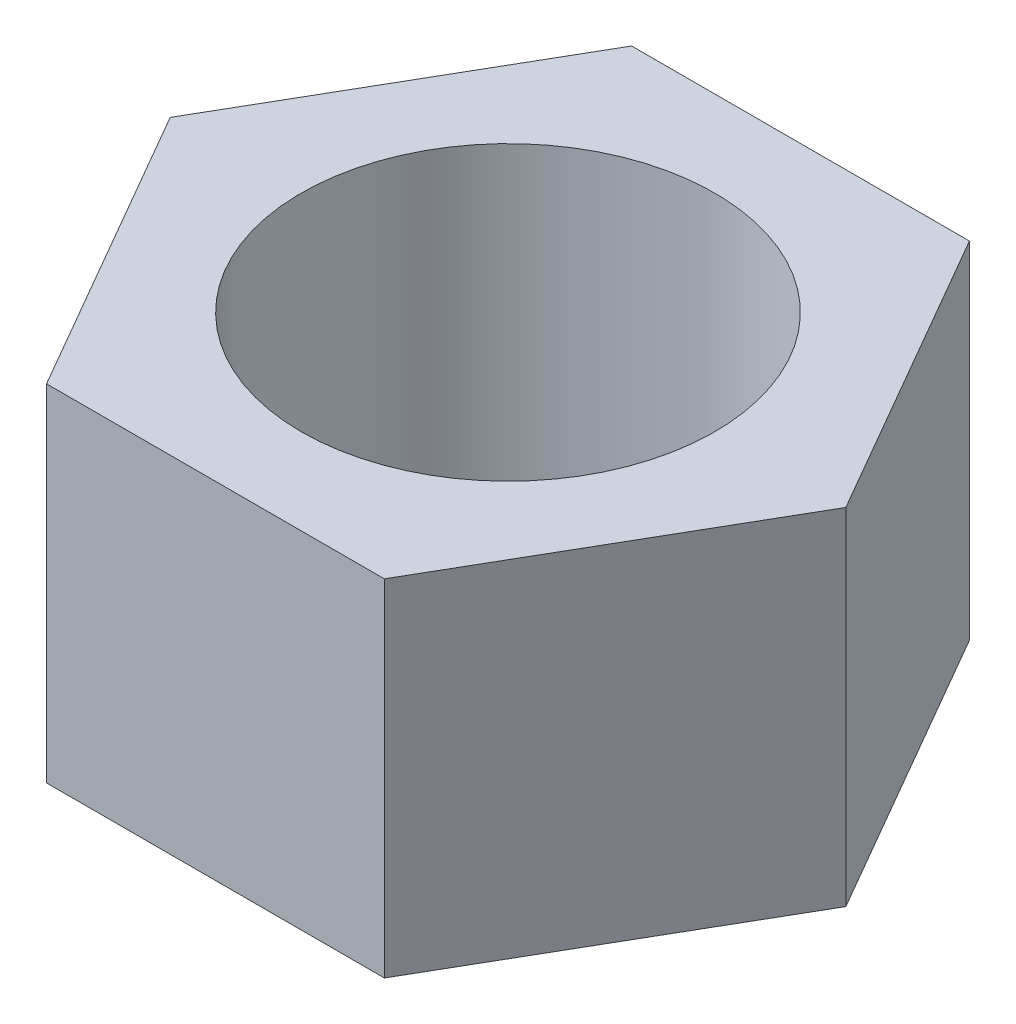
ISO-10303-21;
HEADER;
FILE_DESCRIPTION(('STEP AP214'),'2;1');
FILE_NAME('part.step','',(''),(''),'','','');
FILE_SCHEMA(('AUTOMOTIVE_DESIGN { 1 0 10303 214 1 1 1 1 }'));
ENDSEC;
DATA;
#1=APPLICATION_CONTEXT('core data for automotive mechanical design processes');
#2=APPLICATION_PROTOCOL_DEFINITION('international standard','automotive_design',2000,#1);
#3=PRODUCT_CONTEXT('',#1,'mechanical');
#4=PRODUCT('Part','Part','',(#3));
#5=PRODUCT_RELATED_PRODUCT_CATEGORY('part','',(#4));
#6=PRODUCT_DEFINITION_FORMATION('','',#4);
#7=PRODUCT_DEFINITION_CONTEXT('part definition',#1,'design');
#8=PRODUCT_DEFINITION('design','',#6,#7);
#9=PRODUCT_DEFINITION_SHAPE('','',#8);
#10=(LENGTH_UNIT() NAMED_UNIT(*) SI_UNIT(.MILLI.,.METRE.));
#11=(NAMED_UNIT(*) PLANE_ANGLE_UNIT() SI_UNIT($,.RADIAN.));
#12=(NAMED_UNIT(*) SI_UNIT($,.STERADIAN.) SOLID_ANGLE_UNIT());
#13=UNCERTAINTY_MEASURE_WITH_UNIT(LENGTH_MEASURE(1.E-05),#10,'distance_accuracy_value','');
#14=(GEOMETRIC_REPRESENTATION_CONTEXT(3) GLOBAL_UNCERTAINTY_ASSIGNED_CONTEXT((#13)) GLOBAL_UNIT_ASSIGNED_CONTEXT((#10,
#11,#12)) REPRESENTATION_CONTEXT('',''));
#15=CARTESIAN_POINT('',(0.,0.,0.));
#16=DIRECTION('',(0.,0.,1.));
#17=DIRECTION('',(1.,0.,0.));
#18=AXIS2_PLACEMENT_3D('',#15,#16,#17);
#19=CARTESIAN_POINT('',(4.08475315451667,8.36,7.07499999999993));
#20=DIRECTION('',(-0.866025403784442,0.,-0.499999999999995));
#21=DIRECTION('',(-0.499999999999995,0.,0.866025403784442));
#22=AXIS2_PLACEMENT_3D('',#19,#20,#21);
#23=PLANE('',#22);
#24=DIRECTION('',(0.499999999999995,0.,-0.866025403784442));
#25=VECTOR('',#24,1.);
#26=CARTESIAN_POINT('',(4.08475315451667,0.,7.07499999999993));
#27=LINE('',#26,#25);
#28=CARTESIAN_POINT('',(4.08475315451667,0.,7.07499999999993));
#29=VERTEX_POINT('',#28);
#30=CARTESIAN_POINT('',(8.16950630903318,0.,0.));
#31=VERTEX_POINT('',#30);
#32=EDGE_CURVE('E128',#29,#31,#27,.T.);
#33=ORIENTED_EDGE('',*,*,#32,.T.);
#34=DIRECTION('',(0.,-1.,0.));
#35=VECTOR('',#34,1.);
#36=CARTESIAN_POINT('',(8.16950630903318,8.36,0.));
#37=LINE('',#36,#35);
#38=CARTESIAN_POINT('',(8.16950630903318,8.36,0.));
#39=VERTEX_POINT('',#38);
#40=EDGE_CURVE('E11',#39,#31,#37,.T.);
#41=ORIENTED_EDGE('',*,*,#40,.F.);
#42=DIRECTION('',(0.499999999999995,0.,-0.866025403784442));
#43=VECTOR('',#42,1.);
#44=CARTESIAN_POINT('',(4.08475315451667,8.36,7.07499999999993));
#45=LINE('',#44,#43);
#46=CARTESIAN_POINT('',(4.08475315451667,8.36,7.07499999999993));
#47=VERTEX_POINT('',#46);
#48=EDGE_CURVE('E145',#47,#39,#45,.T.);
#49=ORIENTED_EDGE('',*,*,#48,.F.);
#50=DIRECTION('',(0.,-1.,0.));
#51=VECTOR('',#50,1.);
#52=CARTESIAN_POINT('',(4.08475315451667,8.36,7.07499999999993));
#53=LINE('',#52,#51);
#54=EDGE_CURVE('E124',#47,#29,#53,.T.);
#55=ORIENTED_EDGE('',*,*,#54,.T.);
#56=EDGE_LOOP('',(#33,#41,#49,#55));
#57=FACE_BOUND('',#56,.T.);
#58=ADVANCED_FACE('F39',(#57),#23,.F.);
#59=CARTESIAN_POINT('',(8.16950630903318,8.36,0.));
#60=DIRECTION('',(-0.866025403784438,0.,0.500000000000001));
#61=DIRECTION('',(0.500000000000001,0.,0.866025403784438));
#62=AXIS2_PLACEMENT_3D('',#59,#60,#61);
#63=PLANE('',#62);
#64=DIRECTION('',(-0.500000000000001,0.,-0.866025403784438));
#65=VECTOR('',#64,1.);
#66=CARTESIAN_POINT('',(8.16950630903318,0.,0.));
#67=LINE('',#66,#65);
#68=CARTESIAN_POINT('',(4.08475315451657,0.,-7.07499999999999));
#69=VERTEX_POINT('',#68);
#70=EDGE_CURVE('E132',#31,#69,#67,.T.);
#71=ORIENTED_EDGE('',*,*,#70,.T.);
#72=DIRECTION('',(0.,-1.,0.));
#73=VECTOR('',#72,1.);
#74=CARTESIAN_POINT('',(4.08475315451657,8.36,-7.07499999999999));
#75=LINE('',#74,#73);
#76=CARTESIAN_POINT('',(4.08475315451657,8.36,-7.07499999999999));
#77=VERTEX_POINT('',#76);
#78=EDGE_CURVE('E48',#77,#69,#75,.T.);
#79=ORIENTED_EDGE('',*,*,#78,.F.);
#80=DIRECTION('',(-0.500000000000001,0.,-0.866025403784438));
#81=VECTOR('',#80,1.);
#82=CARTESIAN_POINT('',(8.16950630903318,8.36,0.));
#83=LINE('',#82,#81);
#84=EDGE_CURVE('E93',#39,#77,#83,.T.);
#85=ORIENTED_EDGE('',*,*,#84,.F.);
#86=ORIENTED_EDGE('',*,*,#40,.T.);
#87=EDGE_LOOP('',(#71,#79,#85,#86));
#88=FACE_BOUND('',#87,.T.);
#89=ADVANCED_FACE('F174',(#88),#63,.F.);
#90=CARTESIAN_POINT('',(4.08475315451657,8.36,-7.07499999999999));
#91=DIRECTION('',(0.,0.,1.));
#92=DIRECTION('',(1.,0.,0.));
#93=AXIS2_PLACEMENT_3D('',#90,#91,#92);
#94=PLANE('',#93);
#95=DIRECTION('',(-1.,0.,0.));
#96=VECTOR('',#95,1.);
#97=CARTESIAN_POINT('',(4.08475315451657,0.,-7.07499999999999));
#98=LINE('',#97,#96);
#99=CARTESIAN_POINT('',(-4.08475315451662,0.,-7.07499999999996));
#100=VERTEX_POINT('',#99);
#101=EDGE_CURVE('E136',#69,#100,#98,.T.);
#102=ORIENTED_EDGE('',*,*,#101,.T.);
#103=DIRECTION('',(0.,-1.,0.));
#104=VECTOR('',#103,1.);
#105=CARTESIAN_POINT('',(-4.08475315451662,8.36,-7.07499999999996));
#106=LINE('',#105,#104);
#107=CARTESIAN_POINT('',(-4.08475315451662,8.36,-7.07499999999996));
#108=VERTEX_POINT('',#107);
#109=EDGE_CURVE('E117',#108,#100,#106,.T.);
#110=ORIENTED_EDGE('',*,*,#109,.F.);
#111=DIRECTION('',(-1.,0.,0.));
#112=VECTOR('',#111,1.);
#113=CARTESIAN_POINT('',(4.08475315451657,8.36,-7.07499999999999));
#114=LINE('',#113,#112);
#115=EDGE_CURVE('E106',#77,#108,#114,.T.);
#116=ORIENTED_EDGE('',*,*,#115,.F.);
#117=ORIENTED_EDGE('',*,*,#78,.T.);
#118=EDGE_LOOP('',(#102,#110,#116,#117));
#119=FACE_BOUND('',#118,.T.);
#120=ADVANCED_FACE('F155',(#119),#94,.F.);
#121=CARTESIAN_POINT('',(-4.08475315451662,8.36,-7.07499999999996));
#122=DIRECTION('',(0.866025403784441,0.,0.499999999999995));
#123=DIRECTION('',(0.499999999999995,0.,-0.866025403784442));
#124=AXIS2_PLACEMENT_3D('',#121,#122,#123);
#125=PLANE('',#124);
#126=DIRECTION('',(-0.499999999999995,0.,0.866025403784441));
#127=VECTOR('',#126,1.);
#128=CARTESIAN_POINT('',(-4.08475315451662,0.,-7.07499999999996));
#129=LINE('',#128,#127);
#130=CARTESIAN_POINT('',(-8.16950630903318,0.,0.));
#131=VERTEX_POINT('',#130);
#132=EDGE_CURVE('E115',#100,#131,#129,.T.);
#133=ORIENTED_EDGE('',*,*,#132,.T.);
#134=DIRECTION('',(0.,-1.,0.));
#135=VECTOR('',#134,1.);
#136=CARTESIAN_POINT('',(-8.16950630903318,8.36,0.));
#137=LINE('',#136,#135);
#138=CARTESIAN_POINT('',(-8.16950630903318,8.36,0.));
#139=VERTEX_POINT('',#138);
#140=EDGE_CURVE('E112',#139,#131,#137,.T.);
#141=ORIENTED_EDGE('',*,*,#140,.F.);
#142=DIRECTION('',(-0.499999999999995,0.,0.866025403784441));
#143=VECTOR('',#142,1.);
#144=CARTESIAN_POINT('',(-4.08475315451662,8.36,-7.07499999999996));
#145=LINE('',#144,#143);
#146=EDGE_CURVE('E100',#108,#139,#145,.T.);
#147=ORIENTED_EDGE('',*,*,#146,.F.);
#148=ORIENTED_EDGE('',*,*,#109,.T.);
#149=EDGE_LOOP('',(#133,#141,#147,#148));
#150=FACE_BOUND('',#149,.T.);
#151=ADVANCED_FACE('F113',(#150),#125,.F.);
#152=CARTESIAN_POINT('',(-8.16950630903318,8.36,0.));
#153=DIRECTION('',(0.866025403784435,0.,-0.500000000000007));
#154=DIRECTION('',(-0.500000000000007,0.,-0.866025403784435));
#155=AXIS2_PLACEMENT_3D('',#152,#153,#154);
#156=PLANE('',#155);
#157=DIRECTION('',(0.500000000000007,0.,0.866025403784435));
#158=VECTOR('',#157,1.);
#159=CARTESIAN_POINT('',(-8.16950630903318,0.,0.));
#160=LINE('',#159,#158);
#161=CARTESIAN_POINT('',(-4.08475315451652,0.,7.07500000000001));
#162=VERTEX_POINT('',#161);
#163=EDGE_CURVE('E79',#131,#162,#160,.T.);
#164=ORIENTED_EDGE('',*,*,#163,.T.);
#165=DIRECTION('',(0.,-1.,0.));
#166=VECTOR('',#165,1.);
#167=CARTESIAN_POINT('',(-4.08475315451652,8.36,7.07500000000001));
#168=LINE('',#167,#166);
#169=CARTESIAN_POINT('',(-4.08475315451652,8.36,7.07500000000001));
#170=VERTEX_POINT('',#169);
#171=EDGE_CURVE('E118',#170,#162,#168,.T.);
#172=ORIENTED_EDGE('',*,*,#171,.F.);
#173=DIRECTION('',(0.500000000000007,0.,0.866025403784435));
#174=VECTOR('',#173,1.);
#175=CARTESIAN_POINT('',(-8.16950630903318,8.36,0.));
#176=LINE('',#175,#174);
#177=EDGE_CURVE('E104',#139,#170,#176,.T.);
#178=ORIENTED_EDGE('',*,*,#177,.F.);
#179=ORIENTED_EDGE('',*,*,#140,.T.);
#180=EDGE_LOOP('',(#164,#172,#178,#179));
#181=FACE_BOUND('',#180,.T.);
#182=ADVANCED_FACE('F120',(#181),#156,.F.);
#183=CARTESIAN_POINT('',(-4.08475315451652,8.36,7.07500000000001));
#184=DIRECTION('',(0.,0.,-1.));
#185=DIRECTION('',(-1.,0.,0.));
#186=AXIS2_PLACEMENT_3D('',#183,#184,#185);
#187=PLANE('',#186);
#188=DIRECTION('',(1.,0.,0.));
#189=VECTOR('',#188,1.);
#190=CARTESIAN_POINT('',(-4.08475315451652,0.,7.07500000000001));
#191=LINE('',#190,#189);
#192=EDGE_CURVE('E85',#162,#29,#191,.T.);
#193=ORIENTED_EDGE('',*,*,#192,.T.);
#194=ORIENTED_EDGE('',*,*,#54,.F.);
#195=DIRECTION('',(1.,0.,0.));
#196=VECTOR('',#195,1.);
#197=CARTESIAN_POINT('',(-4.08475315451652,8.36,7.07500000000001));
#198=LINE('',#197,#196);
#199=EDGE_CURVE('E56',#170,#47,#198,.T.);
#200=ORIENTED_EDGE('',*,*,#199,.F.);
#201=ORIENTED_EDGE('',*,*,#171,.T.);
#202=EDGE_LOOP('',(#193,#194,#200,#201));
#203=FACE_BOUND('',#202,.T.);
#204=ADVANCED_FACE('F162',(#203),#187,.F.);
#205=CARTESIAN_POINT('',(0.,8.36,0.));
#206=DIRECTION('',(0.,1.,0.));
#207=DIRECTION('',(0.,0.,1.));
#208=AXIS2_PLACEMENT_3D('',#205,#206,#207);
#209=PLANE('',#208);
#210=CARTESIAN_POINT('',(0.,8.36,0.));
#211=DIRECTION('',(0.,1.,0.));
#212=DIRECTION('',(0.,0.,1.));
#213=AXIS2_PLACEMENT_3D('',#210,#211,#212);
#214=CIRCLE('',#213,5.);
#215=CARTESIAN_POINT('',(0.,8.36,5.));
#216=VERTEX_POINT('',#215);
#217=EDGE_CURVE('E229',#216,#216,#214,.T.);
#218=ORIENTED_EDGE('',*,*,#217,.F.);
#219=EDGE_LOOP('',(#218));
#220=FACE_BOUND('',#219,.T.);
#221=ORIENTED_EDGE('',*,*,#48,.T.);
#222=ORIENTED_EDGE('',*,*,#84,.T.);
#223=ORIENTED_EDGE('',*,*,#115,.T.);
#224=ORIENTED_EDGE('',*,*,#146,.T.);
#225=ORIENTED_EDGE('',*,*,#177,.T.);
#226=ORIENTED_EDGE('',*,*,#199,.T.);
#227=EDGE_LOOP('',(#221,#222,#223,#224,#225,#226));
#228=FACE_BOUND('',#227,.T.);
#229=ADVANCED_FACE('F102',(#220,#228),#209,.T.);
#230=CARTESIAN_POINT('',(0.,0.,0.));
#231=DIRECTION('',(0.,1.,0.));
#232=DIRECTION('',(0.,0.,1.));
#233=AXIS2_PLACEMENT_3D('',#230,#231,#232);
#234=PLANE('',#233);
#235=CARTESIAN_POINT('',(0.,0.,0.));
#236=DIRECTION('',(0.,1.,0.));
#237=DIRECTION('',(0.,0.,1.));
#238=AXIS2_PLACEMENT_3D('',#235,#236,#237);
#239=CIRCLE('',#238,5.);
#240=CARTESIAN_POINT('',(0.,0.,5.));
#241=VERTEX_POINT('',#240);
#242=EDGE_CURVE('E133',#241,#241,#239,.T.);
#243=ORIENTED_EDGE('',*,*,#242,.T.);
#244=EDGE_LOOP('',(#243));
#245=FACE_BOUND('',#244,.T.);
#246=ORIENTED_EDGE('',*,*,#32,.F.);
#247=ORIENTED_EDGE('',*,*,#192,.F.);
#248=ORIENTED_EDGE('',*,*,#163,.F.);
#249=ORIENTED_EDGE('',*,*,#132,.F.);
#250=ORIENTED_EDGE('',*,*,#101,.F.);
#251=ORIENTED_EDGE('',*,*,#70,.F.);
#252=EDGE_LOOP('',(#246,#247,#248,#249,#250,#251));
#253=FACE_BOUND('',#252,.T.);
#254=ADVANCED_FACE('F158',(#245,#253),#234,.F.);
#255=CARTESIAN_POINT('',(0.,0.,0.));
#256=DIRECTION('',(0.,1.,0.));
#257=DIRECTION('',(0.,0.,1.));
#258=AXIS2_PLACEMENT_3D('',#255,#256,#257);
#259=CYLINDRICAL_SURFACE('',#258,5.);
#260=ORIENTED_EDGE('',*,*,#242,.F.);
#261=EDGE_LOOP('',(#260));
#262=FACE_BOUND('',#261,.T.);
#263=ORIENTED_EDGE('',*,*,#217,.T.);
#264=EDGE_LOOP('',(#263));
#265=FACE_BOUND('',#264,.T.);
#266=ADVANCED_FACE('F211',(#262,#265),#259,.F.);
#267=CLOSED_SHELL('',(#58,#89,#120,#151,#182,#204,#229,#254,#266));
#268=MANIFOLD_SOLID_BREP('B2',#267);
#269=ADVANCED_BREP_SHAPE_REPRESENTATION('',(#18,#268),#14);
#270=SHAPE_DEFINITION_REPRESENTATION(#9,#269);
ENDSEC;
END-ISO-10303-21;
